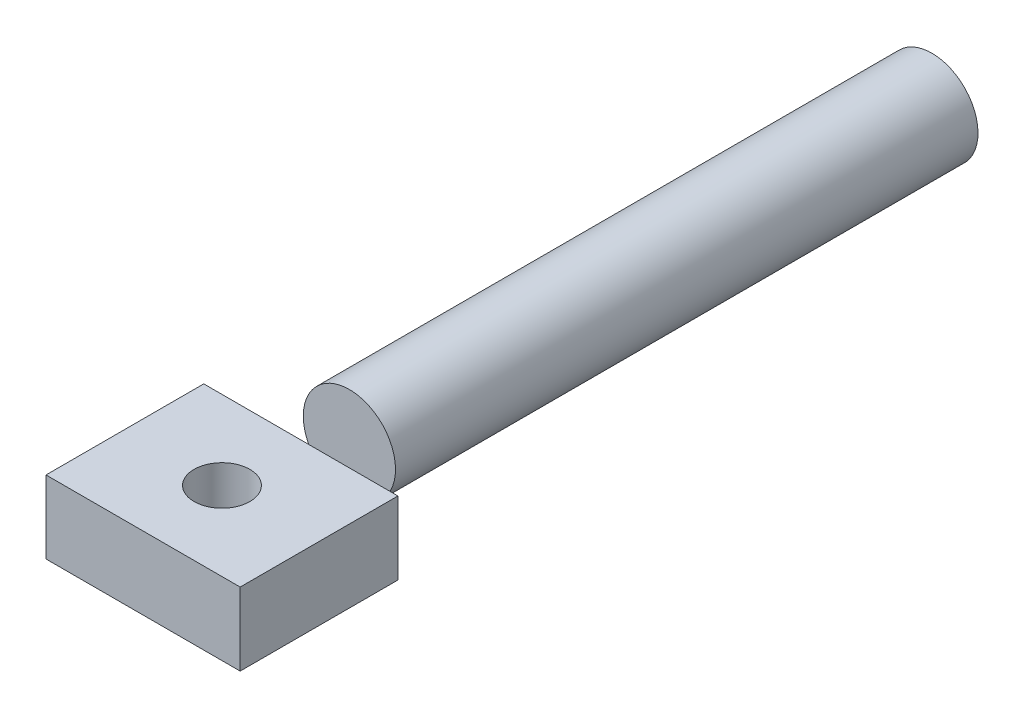
ISO-10303-21;
HEADER;
FILE_DESCRIPTION(('STEP AP214'),'2;1');
FILE_NAME('part.step','',(''),(''),'','','');
FILE_SCHEMA(('AUTOMOTIVE_DESIGN { 1 0 10303 214 1 1 1 1 }'));
ENDSEC;
DATA;
#1=APPLICATION_CONTEXT('core data for automotive mechanical design processes');
#2=APPLICATION_PROTOCOL_DEFINITION('international standard','automotive_design',2000,#1);
#3=PRODUCT_CONTEXT('',#1,'mechanical');
#4=PRODUCT('Part','Part','',(#3));
#5=PRODUCT_RELATED_PRODUCT_CATEGORY('part','',(#4));
#6=PRODUCT_DEFINITION_FORMATION('','',#4);
#7=PRODUCT_DEFINITION_CONTEXT('part definition',#1,'design');
#8=PRODUCT_DEFINITION('design','',#6,#7);
#9=PRODUCT_DEFINITION_SHAPE('','',#8);
#10=(LENGTH_UNIT() NAMED_UNIT(*) SI_UNIT(.MILLI.,.METRE.));
#11=(NAMED_UNIT(*) PLANE_ANGLE_UNIT() SI_UNIT($,.RADIAN.));
#12=(NAMED_UNIT(*) SI_UNIT($,.STERADIAN.) SOLID_ANGLE_UNIT());
#13=UNCERTAINTY_MEASURE_WITH_UNIT(LENGTH_MEASURE(1.E-05),#10,'distance_accuracy_value','');
#14=(GEOMETRIC_REPRESENTATION_CONTEXT(3) GLOBAL_UNCERTAINTY_ASSIGNED_CONTEXT((#13)) GLOBAL_UNIT_ASSIGNED_CONTEXT((#10,
#11,#12)) REPRESENTATION_CONTEXT('',''));
#15=CARTESIAN_POINT('',(0.,0.,0.));
#16=DIRECTION('',(0.,0.,1.));
#17=DIRECTION('',(1.,0.,0.));
#18=AXIS2_PLACEMENT_3D('',#15,#16,#17);
#19=CARTESIAN_POINT('',(0.,0.,-5.25));
#20=DIRECTION('',(0.,0.,-1.));
#21=DIRECTION('',(-1.,0.,0.));
#22=AXIS2_PLACEMENT_3D('',#19,#20,#21);
#23=PLANE('',#22);
#24=CARTESIAN_POINT('',(0.,1.9,-5.25));
#25=DIRECTION('',(0.,0.,-1.));
#26=DIRECTION('',(-1.,0.,0.));
#27=AXIS2_PLACEMENT_3D('',#24,#25,#26);
#28=CIRCLE('',#27,1.9);
#29=CARTESIAN_POINT('',(1.560396540513,0.815950814605224,-5.25));
#30=VERTEX_POINT('',#29);
#31=CARTESIAN_POINT('',(0.,0.,-5.25));
#32=VERTEX_POINT('',#31);
#33=EDGE_CURVE('E42',#30,#32,#28,.T.);
#34=ORIENTED_EDGE('',*,*,#33,.F.);
#35=DIRECTION('',(1.,0.,0.));
#36=VECTOR('',#35,1.);
#37=CARTESIAN_POINT('',(2.,0.815950814605224,-5.25));
#38=LINE('',#37,#36);
#39=CARTESIAN_POINT('',(2.,0.815950814605224,-5.25));
#40=VERTEX_POINT('',#39);
#41=EDGE_CURVE('E116',#30,#40,#38,.T.);
#42=ORIENTED_EDGE('',*,*,#41,.T.);
#43=DIRECTION('',(0.,-1.,0.));
#44=VECTOR('',#43,1.);
#45=CARTESIAN_POINT('',(2.,0.815950814605224,-5.25));
#46=LINE('',#45,#44);
#47=CARTESIAN_POINT('',(2.,0.,-5.25));
#48=VERTEX_POINT('',#47);
#49=EDGE_CURVE('E132',#40,#48,#46,.T.);
#50=ORIENTED_EDGE('',*,*,#49,.T.);
#51=DIRECTION('',(-1.,0.,0.));
#52=VECTOR('',#51,1.);
#53=CARTESIAN_POINT('',(2.,0.,-5.25));
#54=LINE('',#53,#52);
#55=EDGE_CURVE('E137',#48,#32,#54,.T.);
#56=ORIENTED_EDGE('',*,*,#55,.T.);
#57=EDGE_LOOP('',(#34,#42,#50,#56));
#58=FACE_BOUND('',#57,.T.);
#59=ADVANCED_FACE('F32',(#58),#23,.T.);
#60=CARTESIAN_POINT('',(-4.,3.,-3.25));
#61=DIRECTION('',(0.,0.,1.));
#62=DIRECTION('',(1.,0.,0.));
#63=AXIS2_PLACEMENT_3D('',#60,#61,#62);
#64=PLANE('',#63);
#65=DIRECTION('',(0.,-1.,0.));
#66=VECTOR('',#65,1.);
#67=CARTESIAN_POINT('',(2.,0.815950814605224,-3.25));
#68=LINE('',#67,#66);
#69=CARTESIAN_POINT('',(2.,0.815950814605224,-3.25));
#70=VERTEX_POINT('',#69);
#71=CARTESIAN_POINT('',(2.,0.,-3.25));
#72=VERTEX_POINT('',#71);
#73=EDGE_CURVE('E129',#70,#72,#68,.T.);
#74=ORIENTED_EDGE('',*,*,#73,.F.);
#75=DIRECTION('',(1.,0.,0.));
#76=VECTOR('',#75,1.);
#77=CARTESIAN_POINT('',(2.,0.815950814605224,-3.25));
#78=LINE('',#77,#76);
#79=CARTESIAN_POINT('',(-2.,0.815950814605224,-3.25));
#80=VERTEX_POINT('',#79);
#81=EDGE_CURVE('E136',#80,#70,#78,.T.);
#82=ORIENTED_EDGE('',*,*,#81,.F.);
#83=DIRECTION('',(0.,1.,0.));
#84=VECTOR('',#83,1.);
#85=CARTESIAN_POINT('',(-2.,0.815950814605224,-3.25));
#86=LINE('',#85,#84);
#87=CARTESIAN_POINT('',(-2.,0.,-3.25));
#88=VERTEX_POINT('',#87);
#89=EDGE_CURVE('E142',#88,#80,#86,.T.);
#90=ORIENTED_EDGE('',*,*,#89,.F.);
#91=DIRECTION('',(-1.,0.,0.));
#92=VECTOR('',#91,1.);
#93=CARTESIAN_POINT('',(-4.,0.,-3.25));
#94=LINE('',#93,#92);
#95=CARTESIAN_POINT('',(-4.,0.,-3.25));
#96=VERTEX_POINT('',#95);
#97=EDGE_CURVE('E176',#88,#96,#94,.T.);
#98=ORIENTED_EDGE('',*,*,#97,.T.);
#99=DIRECTION('',(0.,-1.,0.));
#100=VECTOR('',#99,1.);
#101=CARTESIAN_POINT('',(-4.,3.,-3.25));
#102=LINE('',#101,#100);
#103=CARTESIAN_POINT('',(-4.,3.,-3.25));
#104=VERTEX_POINT('',#103);
#105=EDGE_CURVE('E186',#104,#96,#102,.T.);
#106=ORIENTED_EDGE('',*,*,#105,.F.);
#107=DIRECTION('',(-1.,0.,0.));
#108=VECTOR('',#107,1.);
#109=CARTESIAN_POINT('',(-4.,3.,-3.25));
#110=LINE('',#109,#108);
#111=CARTESIAN_POINT('',(4.,3.,-3.25));
#112=VERTEX_POINT('',#111);
#113=EDGE_CURVE('E166',#112,#104,#110,.T.);
#114=ORIENTED_EDGE('',*,*,#113,.F.);
#115=DIRECTION('',(0.,-1.,0.));
#116=VECTOR('',#115,1.);
#117=CARTESIAN_POINT('',(4.,3.,-3.25));
#118=LINE('',#117,#116);
#119=CARTESIAN_POINT('',(4.,0.,-3.25));
#120=VERTEX_POINT('',#119);
#121=EDGE_CURVE('E36',#112,#120,#118,.T.);
#122=ORIENTED_EDGE('',*,*,#121,.T.);
#123=EDGE_CURVE('E177',#120,#72,#94,.T.);
#124=ORIENTED_EDGE('',*,*,#123,.T.);
#125=EDGE_LOOP('',(#74,#82,#90,#98,#106,#114,#122,#124));
#126=FACE_BOUND('',#125,.T.);
#127=ADVANCED_FACE('F195',(#126),#64,.F.);
#128=CARTESIAN_POINT('',(0.,3.,0.));
#129=DIRECTION('',(0.,1.,0.));
#130=DIRECTION('',(0.,0.,1.));
#131=AXIS2_PLACEMENT_3D('',#128,#129,#130);
#132=PLANE('',#131);
#133=DIRECTION('',(0.,0.,-1.));
#134=VECTOR('',#133,1.);
#135=CARTESIAN_POINT('',(4.,3.,-3.25));
#136=LINE('',#135,#134);
#137=CARTESIAN_POINT('',(4.,3.,3.25));
#138=VERTEX_POINT('',#137);
#139=EDGE_CURVE('E163',#138,#112,#136,.T.);
#140=ORIENTED_EDGE('',*,*,#139,.T.);
#141=ORIENTED_EDGE('',*,*,#113,.T.);
#142=DIRECTION('',(0.,0.,1.));
#143=VECTOR('',#142,1.);
#144=CARTESIAN_POINT('',(-4.,3.,-3.25));
#145=LINE('',#144,#143);
#146=CARTESIAN_POINT('',(-4.,3.,3.25));
#147=VERTEX_POINT('',#146);
#148=EDGE_CURVE('E169',#104,#147,#145,.T.);
#149=ORIENTED_EDGE('',*,*,#148,.T.);
#150=DIRECTION('',(1.,0.,0.));
#151=VECTOR('',#150,1.);
#152=CARTESIAN_POINT('',(-4.,3.,3.25));
#153=LINE('',#152,#151);
#154=EDGE_CURVE('E171',#147,#138,#153,.T.);
#155=ORIENTED_EDGE('',*,*,#154,.T.);
#156=EDGE_LOOP('',(#140,#141,#149,#155));
#157=FACE_BOUND('',#156,.T.);
#158=CARTESIAN_POINT('',(0.,3.,0.));
#159=DIRECTION('',(0.,1.,0.));
#160=DIRECTION('',(0.,0.,1.));
#161=AXIS2_PLACEMENT_3D('',#158,#159,#160);
#162=CIRCLE('',#161,1.15);
#163=CARTESIAN_POINT('',(0.,3.,1.15));
#164=VERTEX_POINT('',#163);
#165=EDGE_CURVE('E157',#164,#164,#162,.T.);
#166=ORIENTED_EDGE('',*,*,#165,.F.);
#167=EDGE_LOOP('',(#166));
#168=FACE_BOUND('',#167,.T.);
#169=ADVANCED_FACE('F218',(#157,#168),#132,.T.);
#170=CARTESIAN_POINT('',(0.,0.,0.));
#171=DIRECTION('',(0.,1.,0.));
#172=DIRECTION('',(0.,0.,1.));
#173=AXIS2_PLACEMENT_3D('',#170,#171,#172);
#174=PLANE('',#173);
#175=DIRECTION('',(0.,0.,-1.));
#176=VECTOR('',#175,1.);
#177=CARTESIAN_POINT('',(4.,0.,-3.25));
#178=LINE('',#177,#176);
#179=CARTESIAN_POINT('',(4.,0.,3.25));
#180=VERTEX_POINT('',#179);
#181=EDGE_CURVE('E160',#180,#120,#178,.T.);
#182=ORIENTED_EDGE('',*,*,#181,.F.);
#183=DIRECTION('',(1.,0.,0.));
#184=VECTOR('',#183,1.);
#185=CARTESIAN_POINT('',(-4.,0.,3.25));
#186=LINE('',#185,#184);
#187=CARTESIAN_POINT('',(-4.,0.,3.25));
#188=VERTEX_POINT('',#187);
#189=EDGE_CURVE('E167',#188,#180,#186,.T.);
#190=ORIENTED_EDGE('',*,*,#189,.F.);
#191=DIRECTION('',(0.,0.,1.));
#192=VECTOR('',#191,1.);
#193=CARTESIAN_POINT('',(-4.,0.,-3.25));
#194=LINE('',#193,#192);
#195=EDGE_CURVE('E179',#96,#188,#194,.T.);
#196=ORIENTED_EDGE('',*,*,#195,.F.);
#197=ORIENTED_EDGE('',*,*,#97,.F.);
#198=DIRECTION('',(0.,0.,1.));
#199=VECTOR('',#198,1.);
#200=CARTESIAN_POINT('',(-2.,0.,-5.25));
#201=LINE('',#200,#199);
#202=CARTESIAN_POINT('',(-2.,0.,-5.25));
#203=VERTEX_POINT('',#202);
#204=EDGE_CURVE('E150',#203,#88,#201,.T.);
#205=ORIENTED_EDGE('',*,*,#204,.F.);
#206=EDGE_CURVE('E135',#32,#203,#54,.T.);
#207=ORIENTED_EDGE('',*,*,#206,.F.);
#208=ORIENTED_EDGE('',*,*,#55,.F.);
#209=DIRECTION('',(0.,0.,1.));
#210=VECTOR('',#209,1.);
#211=CARTESIAN_POINT('',(2.,0.,-5.25));
#212=LINE('',#211,#210);
#213=EDGE_CURVE('E153',#48,#72,#212,.T.);
#214=ORIENTED_EDGE('',*,*,#213,.T.);
#215=ORIENTED_EDGE('',*,*,#123,.F.);
#216=EDGE_LOOP('',(#182,#190,#196,#197,#205,#207,#208,#214,#215));
#217=FACE_BOUND('',#216,.T.);
#218=CARTESIAN_POINT('',(0.,0.,0.));
#219=DIRECTION('',(0.,1.,0.));
#220=DIRECTION('',(0.,0.,1.));
#221=AXIS2_PLACEMENT_3D('',#218,#219,#220);
#222=CIRCLE('',#221,1.15);
#223=CARTESIAN_POINT('',(0.,0.,1.15));
#224=VERTEX_POINT('',#223);
#225=EDGE_CURVE('E156',#224,#224,#222,.T.);
#226=ORIENTED_EDGE('',*,*,#225,.T.);
#227=EDGE_LOOP('',(#226));
#228=FACE_BOUND('',#227,.T.);
#229=ADVANCED_FACE('F202',(#217,#228),#174,.F.);
#230=CARTESIAN_POINT('',(4.,3.,-3.25));
#231=DIRECTION('',(-1.,0.,0.));
#232=DIRECTION('',(0.,0.,1.));
#233=AXIS2_PLACEMENT_3D('',#230,#231,#232);
#234=PLANE('',#233);
#235=ORIENTED_EDGE('',*,*,#181,.T.);
#236=ORIENTED_EDGE('',*,*,#121,.F.);
#237=ORIENTED_EDGE('',*,*,#139,.F.);
#238=DIRECTION('',(0.,-1.,0.));
#239=VECTOR('',#238,1.);
#240=CARTESIAN_POINT('',(4.,3.,3.25));
#241=LINE('',#240,#239);
#242=EDGE_CURVE('E173',#138,#180,#241,.T.);
#243=ORIENTED_EDGE('',*,*,#242,.T.);
#244=EDGE_LOOP('',(#235,#236,#237,#243));
#245=FACE_BOUND('',#244,.T.);
#246=ADVANCED_FACE('F34',(#245),#234,.F.);
#247=CARTESIAN_POINT('',(-4.,3.,-3.25));
#248=DIRECTION('',(1.,0.,0.));
#249=DIRECTION('',(0.,0.,-1.));
#250=AXIS2_PLACEMENT_3D('',#247,#248,#249);
#251=PLANE('',#250);
#252=ORIENTED_EDGE('',*,*,#195,.T.);
#253=DIRECTION('',(0.,-1.,0.));
#254=VECTOR('',#253,1.);
#255=CARTESIAN_POINT('',(-4.,3.,3.25));
#256=LINE('',#255,#254);
#257=EDGE_CURVE('E184',#147,#188,#256,.T.);
#258=ORIENTED_EDGE('',*,*,#257,.F.);
#259=ORIENTED_EDGE('',*,*,#148,.F.);
#260=ORIENTED_EDGE('',*,*,#105,.T.);
#261=EDGE_LOOP('',(#252,#258,#259,#260));
#262=FACE_BOUND('',#261,.T.);
#263=ADVANCED_FACE('F213',(#262),#251,.F.);
#264=CARTESIAN_POINT('',(-4.,3.,3.25));
#265=DIRECTION('',(0.,0.,-1.));
#266=DIRECTION('',(-1.,0.,0.));
#267=AXIS2_PLACEMENT_3D('',#264,#265,#266);
#268=PLANE('',#267);
#269=ORIENTED_EDGE('',*,*,#189,.T.);
#270=ORIENTED_EDGE('',*,*,#242,.F.);
#271=ORIENTED_EDGE('',*,*,#154,.F.);
#272=ORIENTED_EDGE('',*,*,#257,.T.);
#273=EDGE_LOOP('',(#269,#270,#271,#272));
#274=FACE_BOUND('',#273,.T.);
#275=ADVANCED_FACE('F216',(#274),#268,.F.);
#276=CARTESIAN_POINT('',(0.,3.,0.));
#277=DIRECTION('',(0.,-1.,0.));
#278=DIRECTION('',(0.,0.,-1.));
#279=AXIS2_PLACEMENT_3D('',#276,#277,#278);
#280=CYLINDRICAL_SURFACE('',#279,1.15);
#281=ORIENTED_EDGE('',*,*,#165,.T.);
#282=EDGE_LOOP('',(#281));
#283=FACE_BOUND('',#282,.T.);
#284=ORIENTED_EDGE('',*,*,#225,.F.);
#285=EDGE_LOOP('',(#284));
#286=FACE_BOUND('',#285,.T.);
#287=ADVANCED_FACE('F224',(#283,#286),#280,.F.);
#288=CARTESIAN_POINT('',(2.,0.815950814605224,-5.25));
#289=DIRECTION('',(-1.,0.,0.));
#290=DIRECTION('',(0.,-1.,0.));
#291=AXIS2_PLACEMENT_3D('',#288,#289,#290);
#292=PLANE('',#291);
#293=ORIENTED_EDGE('',*,*,#73,.T.);
#294=ORIENTED_EDGE('',*,*,#213,.F.);
#295=ORIENTED_EDGE('',*,*,#49,.F.);
#296=DIRECTION('',(0.,0.,1.));
#297=VECTOR('',#296,1.);
#298=CARTESIAN_POINT('',(2.,0.815950814605224,-5.25));
#299=LINE('',#298,#297);
#300=EDGE_CURVE('E113',#40,#70,#299,.T.);
#301=ORIENTED_EDGE('',*,*,#300,.T.);
#302=EDGE_LOOP('',(#293,#294,#295,#301));
#303=FACE_BOUND('',#302,.T.);
#304=ADVANCED_FACE('F207',(#303),#292,.F.);
#305=CARTESIAN_POINT('',(-2.,0.815950814605224,-5.25));
#306=DIRECTION('',(1.,0.,0.));
#307=DIRECTION('',(0.,0.,-1.));
#308=AXIS2_PLACEMENT_3D('',#305,#306,#307);
#309=PLANE('',#308);
#310=ORIENTED_EDGE('',*,*,#89,.T.);
#311=DIRECTION('',(0.,0.,1.));
#312=VECTOR('',#311,1.);
#313=CARTESIAN_POINT('',(-2.,0.815950814605224,-5.25));
#314=LINE('',#313,#312);
#315=CARTESIAN_POINT('',(-2.,0.815950814605224,-5.25));
#316=VERTEX_POINT('',#315);
#317=EDGE_CURVE('E148',#316,#80,#314,.T.);
#318=ORIENTED_EDGE('',*,*,#317,.F.);
#319=DIRECTION('',(0.,1.,0.));
#320=VECTOR('',#319,1.);
#321=CARTESIAN_POINT('',(-2.,0.815950814605224,-5.25));
#322=LINE('',#321,#320);
#323=EDGE_CURVE('E109',#203,#316,#322,.T.);
#324=ORIENTED_EDGE('',*,*,#323,.F.);
#325=ORIENTED_EDGE('',*,*,#204,.T.);
#326=EDGE_LOOP('',(#310,#318,#324,#325));
#327=FACE_BOUND('',#326,.T.);
#328=ADVANCED_FACE('F209',(#327),#309,.F.);
#329=CARTESIAN_POINT('',(2.,0.815950814605224,-5.25));
#330=DIRECTION('',(0.,-1.,0.));
#331=DIRECTION('',(0.,0.,-1.));
#332=AXIS2_PLACEMENT_3D('',#329,#330,#331);
#333=PLANE('',#332);
#334=ORIENTED_EDGE('',*,*,#81,.T.);
#335=ORIENTED_EDGE('',*,*,#300,.F.);
#336=ORIENTED_EDGE('',*,*,#41,.F.);
#337=CARTESIAN_POINT('',(-1.56039654051299,0.815950814605224,-5.25));
#338=VERTEX_POINT('',#337);
#339=EDGE_CURVE('E114',#338,#30,#38,.T.);
#340=ORIENTED_EDGE('',*,*,#339,.F.);
#341=EDGE_CURVE('E105',#316,#338,#38,.T.);
#342=ORIENTED_EDGE('',*,*,#341,.F.);
#343=ORIENTED_EDGE('',*,*,#317,.T.);
#344=EDGE_LOOP('',(#334,#335,#336,#340,#342,#343));
#345=FACE_BOUND('',#344,.T.);
#346=ADVANCED_FACE('F120',(#345),#333,.F.);
#347=EDGE_CURVE('E11',#32,#338,#28,.T.);
#348=ORIENTED_EDGE('',*,*,#347,.F.);
#349=ORIENTED_EDGE('',*,*,#206,.T.);
#350=ORIENTED_EDGE('',*,*,#323,.T.);
#351=ORIENTED_EDGE('',*,*,#341,.T.);
#352=EDGE_LOOP('',(#348,#349,#350,#351));
#353=FACE_BOUND('',#352,.T.);
#354=ADVANCED_FACE('F107',(#353),#23,.T.);
#355=CARTESIAN_POINT('',(0.,1.9,-5.25));
#356=DIRECTION('',(0.,0.,-1.));
#357=DIRECTION('',(-1.,0.,0.));
#358=AXIS2_PLACEMENT_3D('',#355,#356,#357);
#359=PLANE('',#358);
#360=EDGE_CURVE('E43',#338,#30,#28,.T.);
#361=ORIENTED_EDGE('',*,*,#360,.F.);
#362=ORIENTED_EDGE('',*,*,#339,.T.);
#363=EDGE_LOOP('',(#361,#362));
#364=FACE_BOUND('',#363,.T.);
#365=ADVANCED_FACE('F124',(#364),#359,.F.);
#366=CARTESIAN_POINT('',(0.,1.9,-29.25));
#367=DIRECTION('',(0.,0.,1.));
#368=DIRECTION('',(1.,0.,0.));
#369=AXIS2_PLACEMENT_3D('',#366,#367,#368);
#370=CYLINDRICAL_SURFACE('',#369,1.9);
#371=CARTESIAN_POINT('',(0.,1.9,-29.25));
#372=DIRECTION('',(0.,0.,-1.));
#373=DIRECTION('',(-1.,0.,0.));
#374=AXIS2_PLACEMENT_3D('',#371,#372,#373);
#375=CIRCLE('',#374,1.9);
#376=CARTESIAN_POINT('',(-1.9,1.9,-29.25));
#377=VERTEX_POINT('',#376);
#378=EDGE_CURVE('E127',#377,#377,#375,.T.);
#379=ORIENTED_EDGE('',*,*,#378,.F.);
#380=EDGE_LOOP('',(#379));
#381=FACE_BOUND('',#380,.T.);
#382=ORIENTED_EDGE('',*,*,#33,.T.);
#383=ORIENTED_EDGE('',*,*,#347,.T.);
#384=ORIENTED_EDGE('',*,*,#360,.T.);
#385=EDGE_LOOP('',(#382,#383,#384));
#386=FACE_BOUND('',#385,.T.);
#387=ADVANCED_FACE('F126',(#381,#386),#370,.T.);
#388=CARTESIAN_POINT('',(0.,1.9,-29.25));
#389=DIRECTION('',(0.,0.,-1.));
#390=DIRECTION('',(-1.,0.,0.));
#391=AXIS2_PLACEMENT_3D('',#388,#389,#390);
#392=PLANE('',#391);
#393=ORIENTED_EDGE('',*,*,#378,.T.);
#394=EDGE_LOOP('',(#393));
#395=FACE_BOUND('',#394,.T.);
#396=ADVANCED_FACE('F297',(#395),#392,.T.);
#397=CLOSED_SHELL('',(#59,#127,#169,#229,#246,#263,#275,#287,#304,#328,#346,#354,#365,#387,#396));
#398=MANIFOLD_SOLID_BREP('B2',#397);
#399=ADVANCED_BREP_SHAPE_REPRESENTATION('',(#18,#398),#14);
#400=SHAPE_DEFINITION_REPRESENTATION(#9,#399);
ENDSEC;
END-ISO-10303-21;
